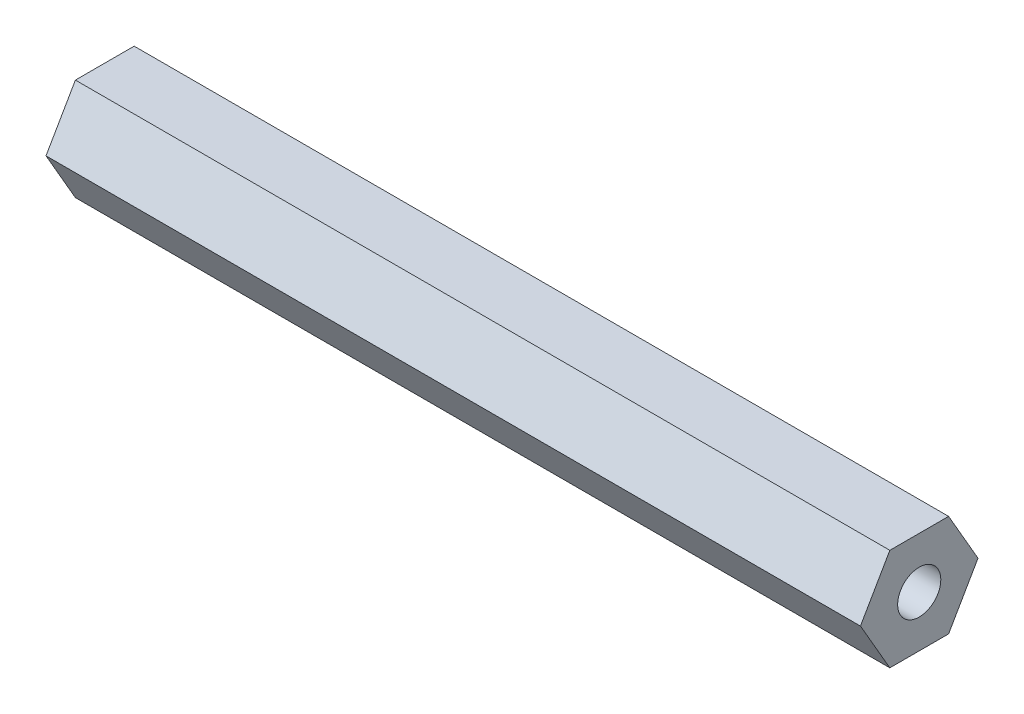
ISO-10303-21;
HEADER;
FILE_DESCRIPTION(('STEP AP214'),'2;1');
FILE_NAME('part.step','',(''),(''),'','','');
FILE_SCHEMA(('AUTOMOTIVE_DESIGN { 1 0 10303 214 1 1 1 1 }'));
ENDSEC;
DATA;
#1=APPLICATION_CONTEXT('core data for automotive mechanical design processes');
#2=APPLICATION_PROTOCOL_DEFINITION('international standard','automotive_design',2000,#1);
#3=PRODUCT_CONTEXT('',#1,'mechanical');
#4=PRODUCT('Part','Part','',(#3));
#5=PRODUCT_RELATED_PRODUCT_CATEGORY('part','',(#4));
#6=PRODUCT_DEFINITION_FORMATION('','',#4);
#7=PRODUCT_DEFINITION_CONTEXT('part definition',#1,'design');
#8=PRODUCT_DEFINITION('design','',#6,#7);
#9=PRODUCT_DEFINITION_SHAPE('','',#8);
#10=(LENGTH_UNIT() NAMED_UNIT(*) SI_UNIT(.MILLI.,.METRE.));
#11=(NAMED_UNIT(*) PLANE_ANGLE_UNIT() SI_UNIT($,.RADIAN.));
#12=(NAMED_UNIT(*) SI_UNIT($,.STERADIAN.) SOLID_ANGLE_UNIT());
#13=UNCERTAINTY_MEASURE_WITH_UNIT(LENGTH_MEASURE(1.E-05),#10,'distance_accuracy_value','');
#14=(GEOMETRIC_REPRESENTATION_CONTEXT(3) GLOBAL_UNCERTAINTY_ASSIGNED_CONTEXT((#13)) GLOBAL_UNIT_ASSIGNED_CONTEXT((#10,
#11,#12)) REPRESENTATION_CONTEXT('',''));
#15=CARTESIAN_POINT('',(0.,0.,0.));
#16=DIRECTION('',(0.,0.,1.));
#17=DIRECTION('',(1.,0.,0.));
#18=AXIS2_PLACEMENT_3D('',#15,#16,#17);
#19=CARTESIAN_POINT('',(38.1,-4.7625,2.74963065701554));
#20=DIRECTION('',(0.,1.,0.));
#21=DIRECTION('',(0.,0.,-1.));
#22=AXIS2_PLACEMENT_3D('',#19,#20,#21);
#23=PLANE('',#22);
#24=DIRECTION('',(-1.,0.,0.));
#25=VECTOR('',#24,1.);
#26=CARTESIAN_POINT('',(38.1,-4.7625,2.74963065701554));
#27=LINE('',#26,#25);
#28=CARTESIAN_POINT('',(50.8,-4.7625,2.74963065701554));
#29=VERTEX_POINT('',#28);
#30=CARTESIAN_POINT('',(-25.4,-4.76250000000003,2.74963065701553));
#31=VERTEX_POINT('',#30);
#32=EDGE_CURVE('E56',#29,#31,#27,.T.);
#33=ORIENTED_EDGE('',*,*,#32,.T.);
#34=DIRECTION('',(0.,0.,-1.));
#35=VECTOR('',#34,1.);
#36=CARTESIAN_POINT('',(-25.4,-4.7625,-5.49926131403119));
#37=LINE('',#36,#35);
#38=CARTESIAN_POINT('',(-25.4,-4.76250000000001,-2.74963065701564));
#39=VERTEX_POINT('',#38);
#40=EDGE_CURVE('E104',#31,#39,#37,.T.);
#41=ORIENTED_EDGE('',*,*,#40,.T.);
#42=DIRECTION('',(-1.,0.,0.));
#43=VECTOR('',#42,1.);
#44=CARTESIAN_POINT('',(38.1,-4.7625,-2.74963065701564));
#45=LINE('',#44,#43);
#46=CARTESIAN_POINT('',(50.8,-4.7625,-2.74963065701564));
#47=VERTEX_POINT('',#46);
#48=EDGE_CURVE('E99',#47,#39,#45,.T.);
#49=ORIENTED_EDGE('',*,*,#48,.F.);
#50=DIRECTION('',(0.,0.,-1.));
#51=VECTOR('',#50,1.);
#52=CARTESIAN_POINT('',(50.8,-4.7625,2.74963065701554));
#53=LINE('',#52,#51);
#54=EDGE_CURVE('E103',#29,#47,#53,.T.);
#55=ORIENTED_EDGE('',*,*,#54,.F.);
#56=EDGE_LOOP('',(#33,#41,#49,#55));
#57=FACE_BOUND('',#56,.T.);
#58=ADVANCED_FACE('F47',(#57),#23,.F.);
#59=CARTESIAN_POINT('',(38.1,0.,5.49926131403117));
#60=DIRECTION('',(0.,0.500000000000007,-0.866025403784435));
#61=DIRECTION('',(-1.,0.,0.));
#62=AXIS2_PLACEMENT_3D('',#59,#60,#61);
#63=PLANE('',#62);
#64=DIRECTION('',(-1.,0.,0.));
#65=VECTOR('',#64,1.);
#66=CARTESIAN_POINT('',(38.1,0.,5.49926131403117));
#67=LINE('',#66,#65);
#68=CARTESIAN_POINT('',(50.8,0.,5.49926131403117));
#69=VERTEX_POINT('',#68);
#70=CARTESIAN_POINT('',(-25.4,0.,5.49926131403117));
#71=VERTEX_POINT('',#70);
#72=EDGE_CURVE('E167',#69,#71,#67,.T.);
#73=ORIENTED_EDGE('',*,*,#72,.T.);
#74=DIRECTION('',(0.,-0.866025403784435,-0.500000000000007));
#75=VECTOR('',#74,1.);
#76=CARTESIAN_POINT('',(-25.4,0.,5.49926131403117));
#77=LINE('',#76,#75);
#78=EDGE_CURVE('E157',#71,#31,#77,.T.);
#79=ORIENTED_EDGE('',*,*,#78,.T.);
#80=ORIENTED_EDGE('',*,*,#32,.F.);
#81=DIRECTION('',(0.,-0.866025403784434,-0.500000000000008));
#82=VECTOR('',#81,1.);
#83=CARTESIAN_POINT('',(50.8,0.,5.49926131403117));
#84=LINE('',#83,#82);
#85=EDGE_CURVE('E125',#69,#29,#84,.T.);
#86=ORIENTED_EDGE('',*,*,#85,.F.);
#87=EDGE_LOOP('',(#73,#79,#80,#86));
#88=FACE_BOUND('',#87,.T.);
#89=ADVANCED_FACE('F49',(#88),#63,.F.);
#90=CARTESIAN_POINT('',(38.1,4.7625,2.7496306570156));
#91=DIRECTION('',(0.,-0.5,-0.866025403784442));
#92=DIRECTION('',(0.,-0.866025403784442,0.5));
#93=AXIS2_PLACEMENT_3D('',#90,#91,#92);
#94=PLANE('',#93);
#95=DIRECTION('',(-1.,0.,0.));
#96=VECTOR('',#95,1.);
#97=CARTESIAN_POINT('',(38.1,4.7625,2.7496306570156));
#98=LINE('',#97,#96);
#99=CARTESIAN_POINT('',(50.8,4.7625,2.7496306570156));
#100=VERTEX_POINT('',#99);
#101=CARTESIAN_POINT('',(-25.4,4.76249999999998,2.7496306570156));
#102=VERTEX_POINT('',#101);
#103=EDGE_CURVE('E163',#100,#102,#98,.T.);
#104=ORIENTED_EDGE('',*,*,#103,.T.);
#105=DIRECTION('',(0.,-0.866025403784439,0.499999999999999));
#106=VECTOR('',#105,1.);
#107=CARTESIAN_POINT('',(-25.4,4.7625,2.7496306570156));
#108=LINE('',#107,#106);
#109=EDGE_CURVE('E153',#102,#71,#108,.T.);
#110=ORIENTED_EDGE('',*,*,#109,.T.);
#111=ORIENTED_EDGE('',*,*,#72,.F.);
#112=DIRECTION('',(0.,-0.866025403784443,0.499999999999993));
#113=VECTOR('',#112,1.);
#114=CARTESIAN_POINT('',(50.8,4.7625,2.7496306570156));
#115=LINE('',#114,#113);
#116=EDGE_CURVE('E139',#100,#69,#115,.T.);
#117=ORIENTED_EDGE('',*,*,#116,.F.);
#118=EDGE_LOOP('',(#104,#110,#111,#117));
#119=FACE_BOUND('',#118,.T.);
#120=ADVANCED_FACE('F178',(#119),#94,.F.);
#121=CARTESIAN_POINT('',(38.1,4.7625,-2.74963065701557));
#122=DIRECTION('',(0.,-1.,0.));
#123=DIRECTION('',(0.,0.,-1.));
#124=AXIS2_PLACEMENT_3D('',#121,#122,#123);
#125=PLANE('',#124);
#126=DIRECTION('',(-1.,0.,0.));
#127=VECTOR('',#126,1.);
#128=CARTESIAN_POINT('',(38.1,4.7625,-2.74963065701557));
#129=LINE('',#128,#127);
#130=CARTESIAN_POINT('',(50.8,4.7625,-2.74963065701557));
#131=VERTEX_POINT('',#130);
#132=CARTESIAN_POINT('',(-25.4,4.7625,-2.74963065701558));
#133=VERTEX_POINT('',#132);
#134=EDGE_CURVE('E107',#131,#133,#129,.T.);
#135=ORIENTED_EDGE('',*,*,#134,.T.);
#136=DIRECTION('',(0.,0.,-1.));
#137=VECTOR('',#136,1.);
#138=CARTESIAN_POINT('',(-25.4,4.76250000000001,-5.49926131403115));
#139=LINE('',#138,#137);
#140=EDGE_CURVE('E144',#102,#133,#139,.T.);
#141=ORIENTED_EDGE('',*,*,#140,.F.);
#142=ORIENTED_EDGE('',*,*,#103,.F.);
#143=DIRECTION('',(0.,0.,1.));
#144=VECTOR('',#143,1.);
#145=CARTESIAN_POINT('',(50.8,4.7625,-2.74963065701557));
#146=LINE('',#145,#144);
#147=EDGE_CURVE('E135',#131,#100,#146,.T.);
#148=ORIENTED_EDGE('',*,*,#147,.F.);
#149=EDGE_LOOP('',(#135,#141,#142,#148));
#150=FACE_BOUND('',#149,.T.);
#151=ADVANCED_FACE('F181',(#150),#125,.F.);
#152=CARTESIAN_POINT('',(38.1,0.,-5.49926131403117));
#153=DIRECTION('',(0.,-0.5,0.866025403784438));
#154=DIRECTION('',(-1.,0.,0.));
#155=AXIS2_PLACEMENT_3D('',#152,#153,#154);
#156=PLANE('',#155);
#157=DIRECTION('',(-1.,0.,0.));
#158=VECTOR('',#157,1.);
#159=CARTESIAN_POINT('',(38.1,0.,-5.49926131403117));
#160=LINE('',#159,#158);
#161=CARTESIAN_POINT('',(50.8,0.,-5.49926131403117));
#162=VERTEX_POINT('',#161);
#163=CARTESIAN_POINT('',(-25.4,0.,-5.49926131403117));
#164=VERTEX_POINT('',#163);
#165=EDGE_CURVE('E108',#162,#164,#160,.T.);
#166=ORIENTED_EDGE('',*,*,#165,.T.);
#167=DIRECTION('',(0.,0.866025403784438,0.5));
#168=VECTOR('',#167,1.);
#169=CARTESIAN_POINT('',(-25.4,0.,-5.49926131403117));
#170=LINE('',#169,#168);
#171=EDGE_CURVE('E63',#164,#133,#170,.T.);
#172=ORIENTED_EDGE('',*,*,#171,.T.);
#173=ORIENTED_EDGE('',*,*,#134,.F.);
#174=DIRECTION('',(0.,0.866025403784438,0.500000000000001));
#175=VECTOR('',#174,1.);
#176=CARTESIAN_POINT('',(50.8,0.,-5.49926131403117));
#177=LINE('',#176,#175);
#178=EDGE_CURVE('E118',#162,#131,#177,.T.);
#179=ORIENTED_EDGE('',*,*,#178,.F.);
#180=EDGE_LOOP('',(#166,#172,#173,#179));
#181=FACE_BOUND('',#180,.T.);
#182=ADVANCED_FACE('F185',(#181),#156,.F.);
#183=CARTESIAN_POINT('',(38.1,-4.7625,-2.74963065701564));
#184=DIRECTION('',(0.,0.5,0.866025403784442));
#185=DIRECTION('',(1.,0.,0.));
#186=AXIS2_PLACEMENT_3D('',#183,#184,#185);
#187=PLANE('',#186);
#188=ORIENTED_EDGE('',*,*,#48,.T.);
#189=DIRECTION('',(0.,0.866025403784439,-0.499999999999999));
#190=VECTOR('',#189,1.);
#191=CARTESIAN_POINT('',(-25.4,-4.7625,-2.74963065701564));
#192=LINE('',#191,#190);
#193=EDGE_CURVE('E67',#39,#164,#192,.T.);
#194=ORIENTED_EDGE('',*,*,#193,.T.);
#195=ORIENTED_EDGE('',*,*,#165,.F.);
#196=DIRECTION('',(0.,0.866025403784444,-0.499999999999991));
#197=VECTOR('',#196,1.);
#198=CARTESIAN_POINT('',(50.8,-4.7625,-2.74963065701564));
#199=LINE('',#198,#197);
#200=EDGE_CURVE('E111',#47,#162,#199,.T.);
#201=ORIENTED_EDGE('',*,*,#200,.F.);
#202=EDGE_LOOP('',(#188,#194,#195,#201));
#203=FACE_BOUND('',#202,.T.);
#204=ADVANCED_FACE('F112',(#203),#187,.F.);
#205=CARTESIAN_POINT('',(-25.4,-4.7625,-5.49926131403119));
#206=DIRECTION('',(1.,0.,0.));
#207=DIRECTION('',(0.,0.,-1.));
#208=AXIS2_PLACEMENT_3D('',#205,#206,#207);
#209=PLANE('',#208);
#210=CARTESIAN_POINT('',(-25.4,0.,0.));
#211=DIRECTION('',(1.,0.,0.));
#212=DIRECTION('',(0.,0.,-1.));
#213=AXIS2_PLACEMENT_3D('',#210,#211,#212);
#214=CIRCLE('',#213,2.0193);
#215=CARTESIAN_POINT('',(-25.4,0.,-2.0193));
#216=VERTEX_POINT('',#215);
#217=EDGE_CURVE('E11',#216,#216,#214,.F.);
#218=ORIENTED_EDGE('',*,*,#217,.F.);
#219=EDGE_LOOP('',(#218));
#220=FACE_BOUND('',#219,.T.);
#221=ORIENTED_EDGE('',*,*,#109,.F.);
#222=ORIENTED_EDGE('',*,*,#140,.T.);
#223=ORIENTED_EDGE('',*,*,#171,.F.);
#224=ORIENTED_EDGE('',*,*,#193,.F.);
#225=ORIENTED_EDGE('',*,*,#40,.F.);
#226=ORIENTED_EDGE('',*,*,#78,.F.);
#227=EDGE_LOOP('',(#221,#222,#223,#224,#225,#226));
#228=FACE_BOUND('',#227,.T.);
#229=ADVANCED_FACE('F183',(#220,#228),#209,.F.);
#230=CARTESIAN_POINT('',(-38.1,0.,0.));
#231=DIRECTION('',(-1.,0.,0.));
#232=DIRECTION('',(0.,0.,1.));
#233=AXIS2_PLACEMENT_3D('',#230,#231,#232);
#234=CYLINDRICAL_SURFACE('',#233,2.0193);
#235=ORIENTED_EDGE('',*,*,#217,.T.);
#236=EDGE_LOOP('',(#235));
#237=FACE_BOUND('',#236,.T.);
#238=CARTESIAN_POINT('',(50.8,0.,0.));
#239=DIRECTION('',(1.,0.,0.));
#240=DIRECTION('',(0.,0.,-1.));
#241=AXIS2_PLACEMENT_3D('',#238,#239,#240);
#242=CIRCLE('',#241,2.0193);
#243=CARTESIAN_POINT('',(50.8,0.,-2.0193));
#244=VERTEX_POINT('',#243);
#245=EDGE_CURVE('E127',#244,#244,#242,.T.);
#246=ORIENTED_EDGE('',*,*,#245,.T.);
#247=EDGE_LOOP('',(#246));
#248=FACE_BOUND('',#247,.T.);
#249=ADVANCED_FACE('F201',(#237,#248),#234,.F.);
#250=CARTESIAN_POINT('',(50.8,0.,0.));
#251=DIRECTION('',(1.,0.,0.));
#252=DIRECTION('',(0.,0.,-1.));
#253=AXIS2_PLACEMENT_3D('',#250,#251,#252);
#254=PLANE('',#253);
#255=ORIENTED_EDGE('',*,*,#54,.T.);
#256=ORIENTED_EDGE('',*,*,#200,.T.);
#257=ORIENTED_EDGE('',*,*,#178,.T.);
#258=ORIENTED_EDGE('',*,*,#147,.T.);
#259=ORIENTED_EDGE('',*,*,#116,.T.);
#260=ORIENTED_EDGE('',*,*,#85,.T.);
#261=EDGE_LOOP('',(#255,#256,#257,#258,#259,#260));
#262=FACE_BOUND('',#261,.T.);
#263=ORIENTED_EDGE('',*,*,#245,.F.);
#264=EDGE_LOOP('',(#263));
#265=FACE_BOUND('',#264,.T.);
#266=ADVANCED_FACE('F121',(#262,#265),#254,.T.);
#267=CLOSED_SHELL('',(#58,#89,#120,#151,#182,#204,#229,#249,#266));
#268=MANIFOLD_SOLID_BREP('B2',#267);
#269=ADVANCED_BREP_SHAPE_REPRESENTATION('',(#18,#268),#14);
#270=SHAPE_DEFINITION_REPRESENTATION(#9,#269);
ENDSEC;
END-ISO-10303-21;
